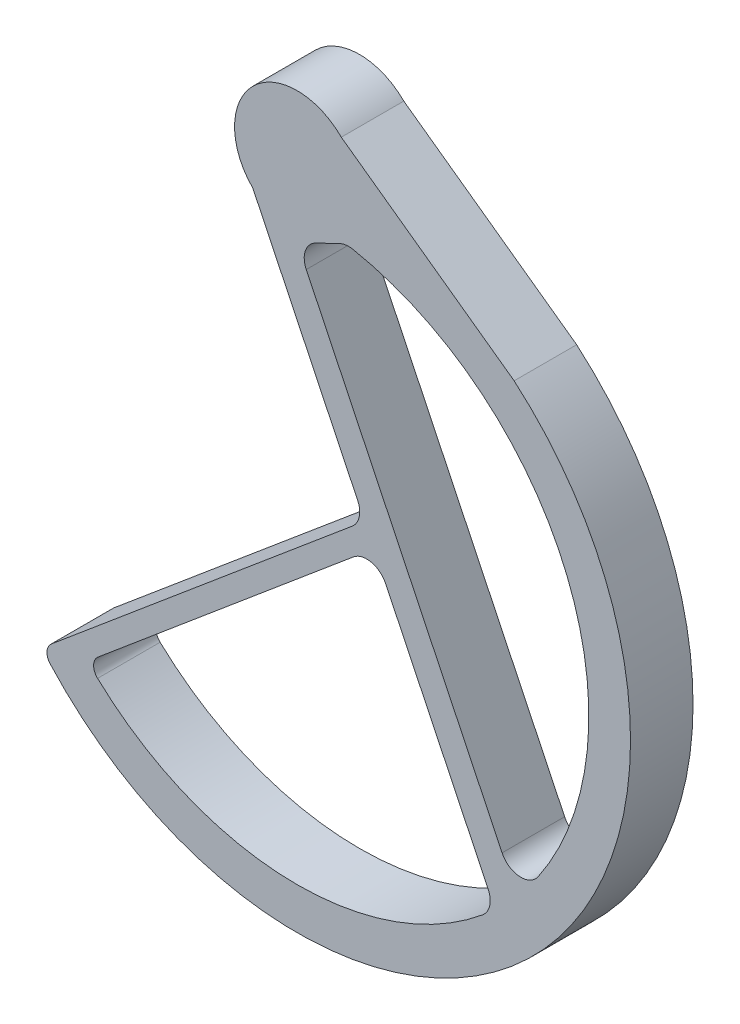
ISO-10303-21;
HEADER;
FILE_DESCRIPTION(('STEP AP214'),'2;1');
FILE_NAME('part.step','',(''),(''),'','','');
FILE_SCHEMA(('AUTOMOTIVE_DESIGN { 1 0 10303 214 1 1 1 1 }'));
ENDSEC;
DATA;
#1=APPLICATION_CONTEXT('core data for automotive mechanical design processes');
#2=APPLICATION_PROTOCOL_DEFINITION('international standard','automotive_design',2000,#1);
#3=PRODUCT_CONTEXT('',#1,'mechanical');
#4=PRODUCT('Part','Part','',(#3));
#5=PRODUCT_RELATED_PRODUCT_CATEGORY('part','',(#4));
#6=PRODUCT_DEFINITION_FORMATION('','',#4);
#7=PRODUCT_DEFINITION_CONTEXT('part definition',#1,'design');
#8=PRODUCT_DEFINITION('design','',#6,#7);
#9=PRODUCT_DEFINITION_SHAPE('','',#8);
#10=(LENGTH_UNIT() NAMED_UNIT(*) SI_UNIT(.MILLI.,.METRE.));
#11=(NAMED_UNIT(*) PLANE_ANGLE_UNIT() SI_UNIT($,.RADIAN.));
#12=(NAMED_UNIT(*) SI_UNIT($,.STERADIAN.) SOLID_ANGLE_UNIT());
#13=UNCERTAINTY_MEASURE_WITH_UNIT(LENGTH_MEASURE(1.E-05),#10,'distance_accuracy_value','');
#14=(GEOMETRIC_REPRESENTATION_CONTEXT(3) GLOBAL_UNCERTAINTY_ASSIGNED_CONTEXT((#13)) GLOBAL_UNIT_ASSIGNED_CONTEXT((#10,
#11,#12)) REPRESENTATION_CONTEXT('',''));
#15=CARTESIAN_POINT('',(0.,0.,0.));
#16=DIRECTION('',(0.,0.,1.));
#17=DIRECTION('',(1.,0.,0.));
#18=AXIS2_PLACEMENT_3D('',#15,#16,#17);
#19=CARTESIAN_POINT('',(-12.7570586950624,-6.1348621133076,15.));
#20=DIRECTION('',(0.901206602628173,0.433389731511241,0.));
#21=DIRECTION('',(-0.433389731511241,0.901206602628173,0.));
#22=AXIS2_PLACEMENT_3D('',#19,#20,#21);
#23=PLANE('',#22);
#24=DIRECTION('',(0.433389731511241,-0.901206602628173,0.));
#25=VECTOR('',#24,1.);
#26=CARTESIAN_POINT('',(-12.7570586950624,-6.1348621133076,0.));
#27=LINE('',#26,#25);
#28=CARTESIAN_POINT('',(21.2324006956412,-76.8137984043253,0.));
#29=VERTEX_POINT('',#28);
#30=CARTESIAN_POINT('',(45.844843506453,-127.9938203457,0.));
#31=VERTEX_POINT('',#30);
#32=EDGE_CURVE('E278',#29,#31,#27,.T.);
#33=ORIENTED_EDGE('',*,*,#32,.T.);
#34=DIRECTION('',(0.,0.,-1.));
#35=VECTOR('',#34,1.);
#36=CARTESIAN_POINT('',(45.844843506453,-127.9938203457,15.));
#37=LINE('',#36,#35);
#38=CARTESIAN_POINT('',(45.844843506453,-127.9938203457,15.));
#39=VERTEX_POINT('',#38);
#40=EDGE_CURVE('E11',#39,#31,#37,.T.);
#41=ORIENTED_EDGE('',*,*,#40,.F.);
#42=DIRECTION('',(0.433389731511241,-0.901206602628173,0.));
#43=VECTOR('',#42,1.);
#44=CARTESIAN_POINT('',(-12.7570586950624,-6.1348621133076,15.));
#45=LINE('',#44,#43);
#46=CARTESIAN_POINT('',(21.2324006956412,-76.8137984043253,15.));
#47=VERTEX_POINT('',#46);
#48=EDGE_CURVE('E244',#47,#39,#45,.T.);
#49=ORIENTED_EDGE('',*,*,#48,.F.);
#50=DIRECTION('',(0.,0.,-1.));
#51=VECTOR('',#50,1.);
#52=CARTESIAN_POINT('',(21.2324006956412,-76.8137984043253,15.));
#53=LINE('',#52,#51);
#54=EDGE_CURVE('E292',#47,#29,#53,.T.);
#55=ORIENTED_EDGE('',*,*,#54,.T.);
#56=EDGE_LOOP('',(#33,#41,#49,#55));
#57=FACE_BOUND('',#56,.T.);
#58=ADVANCED_FACE('F35',(#57),#23,.F.);
#59=CARTESIAN_POINT('',(41.3388104933121,-130.160769003256,15.));
#60=DIRECTION('',(0.,0.,-1.));
#61=DIRECTION('',(-1.,0.,0.));
#62=AXIS2_PLACEMENT_3D('',#59,#60,#61);
#63=CYLINDRICAL_SURFACE('',#62,4.99999999999999);
#64=CARTESIAN_POINT('',(41.3388104933121,-130.160769003256,0.));
#65=DIRECTION('',(0.,0.,1.));
#66=DIRECTION('',(1.,0.,0.));
#67=AXIS2_PLACEMENT_3D('',#64,#65,#66);
#68=CIRCLE('',#67,4.99999999999999);
#69=CARTESIAN_POINT('',(44.5187189927976,-134.019289695814,0.));
#70=VERTEX_POINT('',#69);
#71=EDGE_CURVE('E281',#31,#70,#68,.F.);
#72=ORIENTED_EDGE('',*,*,#71,.T.);
#73=DIRECTION('',(0.,0.,-1.));
#74=VECTOR('',#73,1.);
#75=CARTESIAN_POINT('',(44.5187189927976,-134.019289695814,15.));
#76=LINE('',#75,#74);
#77=CARTESIAN_POINT('',(44.5187189927976,-134.019289695814,15.));
#78=VERTEX_POINT('',#77);
#79=EDGE_CURVE('E44',#78,#70,#76,.T.);
#80=ORIENTED_EDGE('',*,*,#79,.F.);
#81=CARTESIAN_POINT('',(41.3388104933121,-130.160769003256,15.));
#82=DIRECTION('',(0.,0.,1.));
#83=DIRECTION('',(1.,0.,0.));
#84=AXIS2_PLACEMENT_3D('',#81,#82,#83);
#85=CIRCLE('',#84,4.99999999999999);
#86=EDGE_CURVE('E247',#39,#78,#85,.F.);
#87=ORIENTED_EDGE('',*,*,#86,.F.);
#88=ORIENTED_EDGE('',*,*,#40,.T.);
#89=EDGE_LOOP('',(#72,#80,#87,#88));
#90=FACE_BOUND('',#89,.T.);
#91=ADVANCED_FACE('F358',(#90),#63,.F.);
#92=CARTESIAN_POINT('',(0.,-80.,15.));
#93=DIRECTION('',(0.,0.,-1.));
#94=DIRECTION('',(-1.,0.,0.));
#95=AXIS2_PLACEMENT_3D('',#92,#93,#94);
#96=CYLINDRICAL_SURFACE('',#95,70.);
#97=CARTESIAN_POINT('',(0.,-80.,0.));
#98=DIRECTION('',(0.,0.,1.));
#99=DIRECTION('',(1.,0.,0.));
#100=AXIS2_PLACEMENT_3D('',#97,#98,#99);
#101=CIRCLE('',#100,70.);
#102=CARTESIAN_POINT('',(-47.870174388264,-131.072951785042,0.));
#103=VERTEX_POINT('',#102);
#104=EDGE_CURVE('E284',#103,#70,#101,.T.);
#105=ORIENTED_EDGE('',*,*,#104,.F.);
#106=DIRECTION('',(0.,0.,-1.));
#107=VECTOR('',#106,1.);
#108=CARTESIAN_POINT('',(-47.870174388264,-131.072951785042,15.));
#109=LINE('',#108,#107);
#110=CARTESIAN_POINT('',(-47.870174388264,-131.072951785042,15.));
#111=VERTEX_POINT('',#110);
#112=EDGE_CURVE('E301',#111,#103,#109,.T.);
#113=ORIENTED_EDGE('',*,*,#112,.F.);
#114=CARTESIAN_POINT('',(0.,-80.,15.));
#115=DIRECTION('',(0.,0.,1.));
#116=DIRECTION('',(1.,0.,0.));
#117=AXIS2_PLACEMENT_3D('',#114,#115,#116);
#118=CIRCLE('',#117,70.);
#119=EDGE_CURVE('E249',#111,#78,#118,.T.);
#120=ORIENTED_EDGE('',*,*,#119,.T.);
#121=ORIENTED_EDGE('',*,*,#79,.T.);
#122=EDGE_LOOP('',(#105,#113,#120,#121));
#123=FACE_BOUND('',#122,.T.);
#124=ADVANCED_FACE('F364',(#123),#96,.F.);
#125=CARTESIAN_POINT('',(-45.8185954859101,-128.884110994254,15.));
#126=DIRECTION('',(0.,0.,-1.));
#127=DIRECTION('',(-1.,0.,0.));
#128=AXIS2_PLACEMENT_3D('',#125,#126,#127);
#129=CYLINDRICAL_SURFACE('',#128,2.99999999999979);
#130=CARTESIAN_POINT('',(-45.8185954859101,-128.884110994254,0.));
#131=DIRECTION('',(0.,0.,1.));
#132=DIRECTION('',(1.,0.,0.));
#133=AXIS2_PLACEMENT_3D('',#130,#131,#132);
#134=CIRCLE('',#133,2.99999999999979);
#135=CARTESIAN_POINT('',(-47.7476784165524,-126.586582094174,0.));
#136=VERTEX_POINT('',#135);
#137=EDGE_CURVE('E287',#103,#136,#134,.F.);
#138=ORIENTED_EDGE('',*,*,#137,.T.);
#139=DIRECTION('',(0.,0.,-1.));
#140=VECTOR('',#139,1.);
#141=CARTESIAN_POINT('',(-47.7476784165524,-126.586582094174,15.));
#142=LINE('',#141,#140);
#143=CARTESIAN_POINT('',(-47.7476784165524,-126.586582094174,15.));
#144=VERTEX_POINT('',#143);
#145=EDGE_CURVE('E298',#144,#136,#142,.T.);
#146=ORIENTED_EDGE('',*,*,#145,.F.);
#147=CARTESIAN_POINT('',(-45.8185954859101,-128.884110994254,15.));
#148=DIRECTION('',(0.,0.,1.));
#149=DIRECTION('',(1.,0.,0.));
#150=AXIS2_PLACEMENT_3D('',#147,#148,#149);
#151=CIRCLE('',#150,2.99999999999979);
#152=EDGE_CURVE('E252',#111,#144,#151,.F.);
#153=ORIENTED_EDGE('',*,*,#152,.F.);
#154=ORIENTED_EDGE('',*,*,#112,.T.);
#155=EDGE_LOOP('',(#138,#146,#153,#154));
#156=FACE_BOUND('',#155,.T.);
#157=ADVANCED_FACE('F370',(#156),#129,.F.);
#158=CARTESIAN_POINT('',(42.5956727933285,-50.7312504333006,15.));
#159=DIRECTION('',(-0.643027643547508,0.765842966693394,0.));
#160=DIRECTION('',(-0.765842966693394,-0.643027643547508,0.));
#161=AXIS2_PLACEMENT_3D('',#158,#159,#160);
#162=PLANE('',#161);
#163=DIRECTION('',(0.765842966693394,0.643027643547508,0.));
#164=VECTOR('',#163,1.);
#165=CARTESIAN_POINT('',(42.5956727933285,-50.7312504333006,0.));
#166=LINE('',#165,#164);
#167=CARTESIAN_POINT('',(13.5112294647628,-75.1515322284145,0.));
#168=VERTEX_POINT('',#167);
#169=EDGE_CURVE('E289',#136,#168,#166,.T.);
#170=ORIENTED_EDGE('',*,*,#169,.T.);
#171=DIRECTION('',(0.,0.,-1.));
#172=VECTOR('',#171,1.);
#173=CARTESIAN_POINT('',(13.5112294647628,-75.1515322284145,15.));
#174=LINE('',#173,#172);
#175=CARTESIAN_POINT('',(13.5112294647628,-75.1515322284145,15.));
#176=VERTEX_POINT('',#175);
#177=EDGE_CURVE('E295',#176,#168,#174,.T.);
#178=ORIENTED_EDGE('',*,*,#177,.F.);
#179=DIRECTION('',(0.765842966693394,0.643027643547508,0.));
#180=VECTOR('',#179,1.);
#181=CARTESIAN_POINT('',(42.5956727933285,-50.7312504333006,15.));
#182=LINE('',#181,#180);
#183=EDGE_CURVE('E254',#144,#176,#182,.T.);
#184=ORIENTED_EDGE('',*,*,#183,.F.);
#185=ORIENTED_EDGE('',*,*,#145,.T.);
#186=EDGE_LOOP('',(#170,#178,#184,#185));
#187=FACE_BOUND('',#186,.T.);
#188=ADVANCED_FACE('F374',(#187),#162,.F.);
#189=CARTESIAN_POINT('',(10.0302471408598,-65.0565868768263,15.));
#190=DIRECTION('',(0.,0.,-1.));
#191=DIRECTION('',(-1.,0.,0.));
#192=AXIS2_PLACEMENT_3D('',#189,#190,#191);
#193=CYLINDRICAL_SURFACE('',#192,5.);
#194=CARTESIAN_POINT('',(10.0302471408598,-65.0565868768263,0.));
#195=DIRECTION('',(0.,0.,1.));
#196=DIRECTION('',(1.,0.,0.));
#197=AXIS2_PLACEMENT_3D('',#194,#195,#196);
#198=CIRCLE('',#197,5.);
#199=CARTESIAN_POINT('',(13.2441851892925,-68.8868090924212,0.));
#200=VERTEX_POINT('',#199);
#201=CARTESIAN_POINT('',(14.5362801540007,-62.8896382192701,0.));
#202=VERTEX_POINT('',#201);
#203=EDGE_CURVE('E217',#200,#202,#198,.T.);
#204=ORIENTED_EDGE('',*,*,#203,.F.);
#205=DIRECTION('',(0.,0.,-1.));
#206=VECTOR('',#205,1.);
#207=CARTESIAN_POINT('',(13.2441851892925,-68.8868090924212,15.));
#208=LINE('',#207,#206);
#209=CARTESIAN_POINT('',(13.2441851892925,-68.8868090924212,15.));
#210=VERTEX_POINT('',#209);
#211=EDGE_CURVE('E39',#210,#200,#208,.T.);
#212=ORIENTED_EDGE('',*,*,#211,.F.);
#213=CARTESIAN_POINT('',(10.0302471408598,-65.0565868768263,15.));
#214=DIRECTION('',(0.,0.,1.));
#215=DIRECTION('',(1.,0.,0.));
#216=AXIS2_PLACEMENT_3D('',#213,#214,#215);
#217=CIRCLE('',#216,5.);
#218=CARTESIAN_POINT('',(14.5362801540007,-62.8896382192701,15.));
#219=VERTEX_POINT('',#218);
#220=EDGE_CURVE('E225',#210,#219,#217,.T.);
#221=ORIENTED_EDGE('',*,*,#220,.T.);
#222=DIRECTION('',(0.,0.,-1.));
#223=VECTOR('',#222,1.);
#224=CARTESIAN_POINT('',(14.5362801540007,-62.8896382192701,15.));
#225=LINE('',#224,#223);
#226=EDGE_CURVE('E258',#219,#202,#225,.T.);
#227=ORIENTED_EDGE('',*,*,#226,.T.);
#228=EDGE_LOOP('',(#204,#212,#221,#227));
#229=FACE_BOUND('',#228,.T.);
#230=ADVANCED_FACE('F37',(#229),#193,.F.);
#231=CARTESIAN_POINT('',(39.3923101204882,-46.9459271066778,15.));
#232=DIRECTION('',(-0.642787609686534,0.766044443118983,0.));
#233=DIRECTION('',(-0.766044443118982,-0.642787609686534,0.));
#234=AXIS2_PLACEMENT_3D('',#231,#232,#233);
#235=PLANE('',#234);
#236=DIRECTION('',(0.766044443118982,0.642787609686534,0.));
#237=VECTOR('',#236,1.);
#238=CARTESIAN_POINT('',(39.3923101204882,-46.9459271066778,0.));
#239=LINE('',#238,#237);
#240=CARTESIAN_POINT('',(-58.9406362868111,-129.457066169617,0.));
#241=VERTEX_POINT('',#240);
#242=EDGE_CURVE('E261',#241,#200,#239,.T.);
#243=ORIENTED_EDGE('',*,*,#242,.F.);
#244=DIRECTION('',(0.,0.,-1.));
#245=VECTOR('',#244,1.);
#246=CARTESIAN_POINT('',(-58.9406362868111,-129.457066169617,15.));
#247=LINE('',#246,#245);
#248=CARTESIAN_POINT('',(-58.9406362868111,-129.457066169617,15.));
#249=VERTEX_POINT('',#248);
#250=EDGE_CURVE('E313',#249,#241,#247,.T.);
#251=ORIENTED_EDGE('',*,*,#250,.F.);
#252=DIRECTION('',(0.766044443118982,0.642787609686534,0.));
#253=VECTOR('',#252,1.);
#254=CARTESIAN_POINT('',(39.3923101204882,-46.9459271066778,15.));
#255=LINE('',#254,#253);
#256=EDGE_CURVE('E228',#249,#210,#255,.T.);
#257=ORIENTED_EDGE('',*,*,#256,.T.);
#258=ORIENTED_EDGE('',*,*,#211,.T.);
#259=EDGE_LOOP('',(#243,#251,#257,#258));
#260=FACE_BOUND('',#259,.T.);
#261=ADVANCED_FACE('F319',(#260),#235,.T.);
#262=CARTESIAN_POINT('',(-57.0122734577518,-131.755199498973,15.));
#263=DIRECTION('',(0.,0.,-1.));
#264=DIRECTION('',(-1.,0.,0.));
#265=AXIS2_PLACEMENT_3D('',#262,#263,#264);
#266=CYLINDRICAL_SURFACE('',#265,2.99999999999976);
#267=CARTESIAN_POINT('',(-57.0122734577518,-131.755199498973,0.));
#268=DIRECTION('',(0.,0.,1.));
#269=DIRECTION('',(1.,0.,0.));
#270=AXIS2_PLACEMENT_3D('',#267,#268,#269);
#271=CIRCLE('',#270,2.99999999999976);
#272=CARTESIAN_POINT('',(-59.2335308651964,-133.771635843089,0.));
#273=VERTEX_POINT('',#272);
#274=EDGE_CURVE('E264',#273,#241,#271,.F.);
#275=ORIENTED_EDGE('',*,*,#274,.F.);
#276=DIRECTION('',(0.,0.,-1.));
#277=VECTOR('',#276,1.);
#278=CARTESIAN_POINT('',(-59.2335308651964,-133.771635843089,15.));
#279=LINE('',#278,#277);
#280=CARTESIAN_POINT('',(-59.2335308651964,-133.771635843089,15.));
#281=VERTEX_POINT('',#280);
#282=EDGE_CURVE('E312',#281,#273,#279,.T.);
#283=ORIENTED_EDGE('',*,*,#282,.F.);
#284=CARTESIAN_POINT('',(-57.0122734577518,-131.755199498973,15.));
#285=DIRECTION('',(0.,0.,1.));
#286=DIRECTION('',(1.,0.,0.));
#287=AXIS2_PLACEMENT_3D('',#284,#285,#286);
#288=CIRCLE('',#287,2.99999999999976);
#289=EDGE_CURVE('E232',#281,#249,#288,.F.);
#290=ORIENTED_EDGE('',*,*,#289,.T.);
#291=ORIENTED_EDGE('',*,*,#250,.T.);
#292=EDGE_LOOP('',(#275,#283,#290,#291));
#293=FACE_BOUND('',#292,.T.);
#294=ADVANCED_FACE('F327',(#293),#266,.T.);
#295=CARTESIAN_POINT('',(0.,-80.,15.));
#296=DIRECTION('',(0.,0.,-1.));
#297=DIRECTION('',(-1.,0.,0.));
#298=AXIS2_PLACEMENT_3D('',#295,#296,#297);
#299=CYLINDRICAL_SURFACE('',#298,80.);
#300=CARTESIAN_POINT('',(0.,-80.,0.));
#301=DIRECTION('',(0.,0.,1.));
#302=DIRECTION('',(1.,0.,0.));
#303=AXIS2_PLACEMENT_3D('',#300,#301,#302);
#304=CIRCLE('',#303,80.);
#305=CARTESIAN_POINT('',(52.0761789176773,-19.2705047828153,0.));
#306=VERTEX_POINT('',#305);
#307=EDGE_CURVE('E267',#273,#306,#304,.T.);
#308=ORIENTED_EDGE('',*,*,#307,.T.);
#309=DIRECTION('',(0.,0.,-1.));
#310=VECTOR('',#309,1.);
#311=CARTESIAN_POINT('',(52.0761789176773,-19.2705047828153,15.));
#312=LINE('',#311,#310);
#313=CARTESIAN_POINT('',(52.0761789176773,-19.2705047828153,15.));
#314=VERTEX_POINT('',#313);
#315=EDGE_CURVE('E310',#314,#306,#312,.T.);
#316=ORIENTED_EDGE('',*,*,#315,.F.);
#317=CARTESIAN_POINT('',(0.,-80.,15.));
#318=DIRECTION('',(0.,0.,1.));
#319=DIRECTION('',(1.,0.,0.));
#320=AXIS2_PLACEMENT_3D('',#317,#318,#319);
#321=CIRCLE('',#320,80.);
#322=EDGE_CURVE('E235',#281,#314,#321,.T.);
#323=ORIENTED_EDGE('',*,*,#322,.F.);
#324=ORIENTED_EDGE('',*,*,#282,.T.);
#325=EDGE_LOOP('',(#308,#316,#323,#324));
#326=FACE_BOUND('',#325,.T.);
#327=ADVANCED_FACE('F332',(#326),#299,.T.);
#328=CARTESIAN_POINT('',(8.65474635415258,12.0128323695446,15.));
#329=DIRECTION('',(0.584549661802916,0.811357931424902,0.));
#330=DIRECTION('',(-0.811357931424902,0.584549661802916,0.));
#331=AXIS2_PLACEMENT_3D('',#328,#329,#330);
#332=PLANE('',#331);
#333=DIRECTION('',(0.811357931424902,-0.584549661802916,0.));
#334=VECTOR('',#333,1.);
#335=CARTESIAN_POINT('',(8.65474635415258,12.0128323695446,0.));
#336=LINE('',#335,#334);
#337=CARTESIAN_POINT('',(10.6066017177981,10.6066017177983,0.));
#338=VERTEX_POINT('',#337);
#339=EDGE_CURVE('E270',#338,#306,#336,.T.);
#340=ORIENTED_EDGE('',*,*,#339,.F.);
#341=DIRECTION('',(0.,0.,-1.));
#342=VECTOR('',#341,1.);
#343=CARTESIAN_POINT('',(10.6066017177981,10.6066017177983,15.));
#344=LINE('',#343,#342);
#345=CARTESIAN_POINT('',(10.6066017177981,10.6066017177983,15.));
#346=VERTEX_POINT('',#345);
#347=EDGE_CURVE('E308',#346,#338,#344,.T.);
#348=ORIENTED_EDGE('',*,*,#347,.F.);
#349=DIRECTION('',(0.811357931424902,-0.584549661802916,0.));
#350=VECTOR('',#349,1.);
#351=CARTESIAN_POINT('',(8.65474635415258,12.0128323695446,15.));
#352=LINE('',#351,#350);
#353=EDGE_CURVE('E237',#346,#314,#352,.T.);
#354=ORIENTED_EDGE('',*,*,#353,.T.);
#355=ORIENTED_EDGE('',*,*,#315,.T.);
#356=EDGE_LOOP('',(#340,#348,#354,#355));
#357=FACE_BOUND('',#356,.T.);
#358=ADVANCED_FACE('F346',(#357),#332,.T.);
#359=CARTESIAN_POINT('',(0.,0.,15.));
#360=DIRECTION('',(0.,0.,-1.));
#361=DIRECTION('',(-1.,0.,0.));
#362=AXIS2_PLACEMENT_3D('',#359,#360,#361);
#363=CYLINDRICAL_SURFACE('',#362,15.);
#364=CARTESIAN_POINT('',(0.,0.,0.));
#365=DIRECTION('',(0.,0.,1.));
#366=DIRECTION('',(1.,0.,0.));
#367=AXIS2_PLACEMENT_3D('',#364,#365,#366);
#368=CIRCLE('',#367,15.);
#369=CARTESIAN_POINT('',(-10.6066017177981,-10.6066017177983,0.));
#370=VERTEX_POINT('',#369);
#371=EDGE_CURVE('E273',#338,#370,#368,.T.);
#372=ORIENTED_EDGE('',*,*,#371,.T.);
#373=DIRECTION('',(0.,0.,-1.));
#374=VECTOR('',#373,1.);
#375=CARTESIAN_POINT('',(-10.6066017177981,-10.6066017177983,15.));
#376=LINE('',#375,#374);
#377=CARTESIAN_POINT('',(-10.6066017177981,-10.6066017177983,15.));
#378=VERTEX_POINT('',#377);
#379=EDGE_CURVE('E305',#378,#370,#376,.T.);
#380=ORIENTED_EDGE('',*,*,#379,.F.);
#381=CARTESIAN_POINT('',(0.,0.,15.));
#382=DIRECTION('',(0.,0.,1.));
#383=DIRECTION('',(1.,0.,0.));
#384=AXIS2_PLACEMENT_3D('',#381,#382,#383);
#385=CIRCLE('',#384,15.);
#386=EDGE_CURVE('E240',#346,#378,#385,.T.);
#387=ORIENTED_EDGE('',*,*,#386,.F.);
#388=ORIENTED_EDGE('',*,*,#347,.T.);
#389=EDGE_LOOP('',(#372,#380,#387,#388));
#390=FACE_BOUND('',#389,.T.);
#391=ADVANCED_FACE('F347',(#390),#363,.T.);
#392=CARTESIAN_POINT('',(-12.7570586950624,-6.13486211330761,15.));
#393=DIRECTION('',(0.901206602628173,0.433389731511242,0.));
#394=DIRECTION('',(-0.433389731511242,0.901206602628173,0.));
#395=AXIS2_PLACEMENT_3D('',#392,#393,#394);
#396=PLANE('',#395);
#397=DIRECTION('',(0.433389731511242,-0.901206602628173,0.));
#398=VECTOR('',#397,1.);
#399=CARTESIAN_POINT('',(-12.7570586950624,-6.13486211330761,0.));
#400=LINE('',#399,#398);
#401=EDGE_CURVE('E275',#370,#202,#400,.T.);
#402=ORIENTED_EDGE('',*,*,#401,.T.);
#403=ORIENTED_EDGE('',*,*,#226,.F.);
#404=DIRECTION('',(0.433389731511242,-0.901206602628173,0.));
#405=VECTOR('',#404,1.);
#406=CARTESIAN_POINT('',(-12.7570586950624,-6.13486211330761,15.));
#407=LINE('',#406,#405);
#408=EDGE_CURVE('E242',#378,#219,#407,.T.);
#409=ORIENTED_EDGE('',*,*,#408,.F.);
#410=ORIENTED_EDGE('',*,*,#379,.T.);
#411=EDGE_LOOP('',(#402,#403,#409,#410));
#412=FACE_BOUND('',#411,.T.);
#413=ADVANCED_FACE('F341',(#412),#396,.F.);
#414=CARTESIAN_POINT('',(16.7263676825004,-78.9807470618814,15.));
#415=DIRECTION('',(0.,0.,-1.));
#416=DIRECTION('',(-1.,0.,0.));
#417=AXIS2_PLACEMENT_3D('',#414,#415,#416);
#418=CYLINDRICAL_SURFACE('',#417,5.);
#419=CARTESIAN_POINT('',(16.7263676825004,-78.9807470618814,0.));
#420=DIRECTION('',(0.,0.,1.));
#421=DIRECTION('',(1.,0.,0.));
#422=AXIS2_PLACEMENT_3D('',#419,#420,#421);
#423=CIRCLE('',#422,5.);
#424=EDGE_CURVE('E229',#168,#29,#423,.F.);
#425=ORIENTED_EDGE('',*,*,#424,.T.);
#426=ORIENTED_EDGE('',*,*,#54,.F.);
#427=CARTESIAN_POINT('',(16.7263676825004,-78.9807470618814,15.));
#428=DIRECTION('',(0.,0.,1.));
#429=DIRECTION('',(1.,0.,0.));
#430=AXIS2_PLACEMENT_3D('',#427,#428,#429);
#431=CIRCLE('',#430,5.);
#432=EDGE_CURVE('E256',#176,#47,#431,.F.);
#433=ORIENTED_EDGE('',*,*,#432,.F.);
#434=ORIENTED_EDGE('',*,*,#177,.T.);
#435=EDGE_LOOP('',(#425,#426,#433,#434));
#436=FACE_BOUND('',#435,.T.);
#437=ADVANCED_FACE('F354',(#436),#418,.F.);
#438=CARTESIAN_POINT('',(0.,0.,15.));
#439=DIRECTION('',(0.,0.,1.));
#440=DIRECTION('',(1.,0.,0.));
#441=AXIS2_PLACEMENT_3D('',#438,#439,#440);
#442=PLANE('',#441);
#443=CARTESIAN_POINT('',(6.70778479931193,-18.9220720384942,15.));
#444=DIRECTION('',(0.,0.,1.));
#445=DIRECTION('',(-1.,0.,0.));
#446=AXIS2_PLACEMENT_3D('',#443,#444,#445);
#447=CIRCLE('',#446,5.);
#448=CARTESIAN_POINT('',(4.54083614175573,-14.4160390253533,15.));
#449=VERTEX_POINT('',#448);
#450=CARTESIAN_POINT('',(2.20175178617109,-21.0890206960504,15.));
#451=VERTEX_POINT('',#450);
#452=EDGE_CURVE('E52',#449,#451,#447,.T.);
#453=ORIENTED_EDGE('',*,*,#452,.F.);
#454=DIRECTION('',(-0.901206602628171,-0.433389731511247,0.));
#455=VECTOR('',#454,1.);
#456=CARTESIAN_POINT('',(6.4834156052804,-13.4818536901804,15.));
#457=LINE('',#456,#455);
#458=CARTESIAN_POINT('',(10.2196588467731,-11.6850964864837,15.));
#459=VERTEX_POINT('',#458);
#460=EDGE_CURVE('E187',#459,#449,#457,.T.);
#461=ORIENTED_EDGE('',*,*,#460,.F.);
#462=CARTESIAN_POINT('',(12.3866075043293,-16.1911294996245,15.));
#463=DIRECTION('',(0.,0.,1.));
#464=DIRECTION('',(1.,0.,0.));
#465=AXIS2_PLACEMENT_3D('',#462,#463,#464);
#466=CIRCLE('',#465,5.);
#467=CARTESIAN_POINT('',(13.3394234662008,-11.2827548457495,15.));
#468=VERTEX_POINT('',#467);
#469=EDGE_CURVE('E190',#468,#459,#466,.T.);
#470=ORIENTED_EDGE('',*,*,#469,.F.);
#471=CARTESIAN_POINT('',(0.,-80.,15.));
#472=DIRECTION('',(0.,0.,1.));
#473=DIRECTION('',(1.,0.,0.));
#474=AXIS2_PLACEMENT_3D('',#471,#472,#473);
#475=CIRCLE('',#474,69.9999999999999);
#476=CARTESIAN_POINT('',(57.8260553336624,-119.448033215209,15.));
#477=VERTEX_POINT('',#476);
#478=EDGE_CURVE('E210',#477,#468,#475,.T.);
#479=ORIENTED_EDGE('',*,*,#478,.F.);
#480=CARTESIAN_POINT('',(53.6956228098294,-116.63031655698,15.));
#481=DIRECTION('',(0.,0.,1.));
#482=DIRECTION('',(-1.,0.,0.));
#483=AXIS2_PLACEMENT_3D('',#480,#481,#482);
#484=CIRCLE('',#483,5.);
#485=CARTESIAN_POINT('',(49.1895897966885,-118.797265214536,15.));
#486=VERTEX_POINT('',#485);
#487=EDGE_CURVE('E207',#486,#477,#484,.T.);
#488=ORIENTED_EDGE('',*,*,#487,.F.);
#489=DIRECTION('',(0.433389731511244,-0.901206602628172,0.));
#490=VECTOR('',#489,1.);
#491=CARTESIAN_POINT('',(49.1895897966885,-118.797265214536,15.));
#492=LINE('',#491,#490);
#493=EDGE_CURVE('E204',#451,#486,#492,.T.);
#494=ORIENTED_EDGE('',*,*,#493,.F.);
#495=EDGE_LOOP('',(#453,#461,#470,#479,#488,#494));
#496=FACE_BOUND('',#495,.T.);
#497=ORIENTED_EDGE('',*,*,#220,.F.);
#498=ORIENTED_EDGE('',*,*,#256,.F.);
#499=ORIENTED_EDGE('',*,*,#289,.F.);
#500=ORIENTED_EDGE('',*,*,#322,.T.);
#501=ORIENTED_EDGE('',*,*,#353,.F.);
#502=ORIENTED_EDGE('',*,*,#386,.T.);
#503=ORIENTED_EDGE('',*,*,#408,.T.);
#504=EDGE_LOOP('',(#497,#498,#499,#500,#501,#502,#503));
#505=FACE_BOUND('',#504,.T.);
#506=ORIENTED_EDGE('',*,*,#48,.T.);
#507=ORIENTED_EDGE('',*,*,#86,.T.);
#508=ORIENTED_EDGE('',*,*,#119,.F.);
#509=ORIENTED_EDGE('',*,*,#152,.T.);
#510=ORIENTED_EDGE('',*,*,#183,.T.);
#511=ORIENTED_EDGE('',*,*,#432,.T.);
#512=EDGE_LOOP('',(#506,#507,#508,#509,#510,#511));
#513=FACE_BOUND('',#512,.T.);
#514=ADVANCED_FACE('F335',(#496,#505,#513),#442,.T.);
#515=CARTESIAN_POINT('',(0.,0.,0.));
#516=DIRECTION('',(0.,0.,1.));
#517=DIRECTION('',(1.,0.,0.));
#518=AXIS2_PLACEMENT_3D('',#515,#516,#517);
#519=PLANE('',#518);
#520=CARTESIAN_POINT('',(0.,0.,0.));
#521=DIRECTION('',(0.,0.,-1.));
#522=DIRECTION('',(-1.,0.,0.));
#523=AXIS2_PLACEMENT_3D('',#520,#521,#522);
#524=CIRCLE('',#523,10.);
#525=CARTESIAN_POINT('',(-10.,0.,0.));
#526=VERTEX_POINT('',#525);
#527=EDGE_CURVE('E193',#526,#526,#524,.T.);
#528=ORIENTED_EDGE('',*,*,#527,.F.);
#529=EDGE_LOOP('',(#528));
#530=FACE_BOUND('',#529,.T.);
#531=DIRECTION('',(-0.90120660262817,-0.433389731511248,0.));
#532=VECTOR('',#531,1.);
#533=CARTESIAN_POINT('',(6.4834156052804,-13.4818536901804,0.));
#534=LINE('',#533,#532);
#535=CARTESIAN_POINT('',(10.2196588467731,-11.6850964864837,0.));
#536=VERTEX_POINT('',#535);
#537=CARTESIAN_POINT('',(4.54083614175573,-14.4160390253533,0.));
#538=VERTEX_POINT('',#537);
#539=EDGE_CURVE('E176',#536,#538,#534,.T.);
#540=ORIENTED_EDGE('',*,*,#539,.T.);
#541=CARTESIAN_POINT('',(6.70778479931193,-18.9220720384942,0.));
#542=DIRECTION('',(0.,0.,1.));
#543=DIRECTION('',(-1.,0.,0.));
#544=AXIS2_PLACEMENT_3D('',#541,#542,#543);
#545=CIRCLE('',#544,5.);
#546=CARTESIAN_POINT('',(2.20175178617109,-21.0890206960504,0.));
#547=VERTEX_POINT('',#546);
#548=EDGE_CURVE('E170',#538,#547,#545,.T.);
#549=ORIENTED_EDGE('',*,*,#548,.T.);
#550=DIRECTION('',(0.433389731511244,-0.901206602628172,0.));
#551=VECTOR('',#550,1.);
#552=CARTESIAN_POINT('',(49.1895897966885,-118.797265214536,0.));
#553=LINE('',#552,#551);
#554=CARTESIAN_POINT('',(49.1895897966885,-118.797265214536,0.));
#555=VERTEX_POINT('',#554);
#556=EDGE_CURVE('E179',#547,#555,#553,.T.);
#557=ORIENTED_EDGE('',*,*,#556,.T.);
#558=CARTESIAN_POINT('',(53.6956228098294,-116.63031655698,0.));
#559=DIRECTION('',(0.,0.,1.));
#560=DIRECTION('',(-1.,0.,0.));
#561=AXIS2_PLACEMENT_3D('',#558,#559,#560);
#562=CIRCLE('',#561,5.);
#563=CARTESIAN_POINT('',(57.8260553336624,-119.448033215209,0.));
#564=VERTEX_POINT('',#563);
#565=EDGE_CURVE('E60',#555,#564,#562,.T.);
#566=ORIENTED_EDGE('',*,*,#565,.T.);
#567=CARTESIAN_POINT('',(0.,-80.,0.));
#568=DIRECTION('',(0.,0.,1.));
#569=DIRECTION('',(1.,0.,0.));
#570=AXIS2_PLACEMENT_3D('',#567,#568,#569);
#571=CIRCLE('',#570,69.9999999999999);
#572=CARTESIAN_POINT('',(13.3394234662008,-11.2827548457495,0.));
#573=VERTEX_POINT('',#572);
#574=EDGE_CURVE('E197',#564,#573,#571,.T.);
#575=ORIENTED_EDGE('',*,*,#574,.T.);
#576=CARTESIAN_POINT('',(12.3866075043293,-16.1911294996245,0.));
#577=DIRECTION('',(0.,0.,1.));
#578=DIRECTION('',(1.,0.,0.));
#579=AXIS2_PLACEMENT_3D('',#576,#577,#578);
#580=CIRCLE('',#579,5.);
#581=EDGE_CURVE('E200',#573,#536,#580,.T.);
#582=ORIENTED_EDGE('',*,*,#581,.T.);
#583=EDGE_LOOP('',(#540,#549,#557,#566,#575,#582));
#584=FACE_BOUND('',#583,.T.);
#585=ORIENTED_EDGE('',*,*,#203,.T.);
#586=ORIENTED_EDGE('',*,*,#401,.F.);
#587=ORIENTED_EDGE('',*,*,#371,.F.);
#588=ORIENTED_EDGE('',*,*,#339,.T.);
#589=ORIENTED_EDGE('',*,*,#307,.F.);
#590=ORIENTED_EDGE('',*,*,#274,.T.);
#591=ORIENTED_EDGE('',*,*,#242,.T.);
#592=EDGE_LOOP('',(#585,#586,#587,#588,#589,#590,#591));
#593=FACE_BOUND('',#592,.T.);
#594=ORIENTED_EDGE('',*,*,#32,.F.);
#595=ORIENTED_EDGE('',*,*,#424,.F.);
#596=ORIENTED_EDGE('',*,*,#169,.F.);
#597=ORIENTED_EDGE('',*,*,#137,.F.);
#598=ORIENTED_EDGE('',*,*,#104,.T.);
#599=ORIENTED_EDGE('',*,*,#71,.F.);
#600=EDGE_LOOP('',(#594,#595,#596,#597,#598,#599));
#601=FACE_BOUND('',#600,.T.);
#602=ADVANCED_FACE('F183',(#530,#584,#593,#601),#519,.F.);
#603=CARTESIAN_POINT('',(6.70778479931193,-18.9220720384942,0.));
#604=DIRECTION('',(0.,0.,1.));
#605=DIRECTION('',(1.,0.,0.));
#606=AXIS2_PLACEMENT_3D('',#603,#604,#605);
#607=CYLINDRICAL_SURFACE('',#606,5.);
#608=ORIENTED_EDGE('',*,*,#452,.T.);
#609=DIRECTION('',(0.,0.,1.));
#610=VECTOR('',#609,1.);
#611=CARTESIAN_POINT('',(2.20175178617109,-21.0890206960504,0.));
#612=LINE('',#611,#610);
#613=EDGE_CURVE('E166',#547,#451,#612,.T.);
#614=ORIENTED_EDGE('',*,*,#613,.F.);
#615=ORIENTED_EDGE('',*,*,#548,.F.);
#616=DIRECTION('',(0.,0.,1.));
#617=VECTOR('',#616,1.);
#618=CARTESIAN_POINT('',(4.54083614175573,-14.4160390253533,0.));
#619=LINE('',#618,#617);
#620=EDGE_CURVE('E215',#538,#449,#619,.T.);
#621=ORIENTED_EDGE('',*,*,#620,.T.);
#622=EDGE_LOOP('',(#608,#614,#615,#621));
#623=FACE_BOUND('',#622,.T.);
#624=ADVANCED_FACE('F168',(#623),#607,.F.);
#625=CARTESIAN_POINT('',(6.4834156052804,-13.4818536901804,0.));
#626=DIRECTION('',(-0.433389731511247,0.901206602628171,0.));
#627=DIRECTION('',(-0.901206602628171,-0.433389731511247,0.));
#628=AXIS2_PLACEMENT_3D('',#625,#626,#627);
#629=PLANE('',#628);
#630=ORIENTED_EDGE('',*,*,#460,.T.);
#631=ORIENTED_EDGE('',*,*,#620,.F.);
#632=ORIENTED_EDGE('',*,*,#539,.F.);
#633=DIRECTION('',(0.,0.,1.));
#634=VECTOR('',#633,1.);
#635=CARTESIAN_POINT('',(10.2196588467731,-11.6850964864837,0.));
#636=LINE('',#635,#634);
#637=EDGE_CURVE('E218',#536,#459,#636,.T.);
#638=ORIENTED_EDGE('',*,*,#637,.T.);
#639=EDGE_LOOP('',(#630,#631,#632,#638));
#640=FACE_BOUND('',#639,.T.);
#641=ADVANCED_FACE('F390',(#640),#629,.F.);
#642=CARTESIAN_POINT('',(12.3866075043293,-16.1911294996245,0.));
#643=DIRECTION('',(0.,0.,1.));
#644=DIRECTION('',(1.,0.,0.));
#645=AXIS2_PLACEMENT_3D('',#642,#643,#644);
#646=CYLINDRICAL_SURFACE('',#645,5.);
#647=ORIENTED_EDGE('',*,*,#469,.T.);
#648=ORIENTED_EDGE('',*,*,#637,.F.);
#649=ORIENTED_EDGE('',*,*,#581,.F.);
#650=DIRECTION('',(0.,0.,1.));
#651=VECTOR('',#650,1.);
#652=CARTESIAN_POINT('',(13.3394234662008,-11.2827548457495,0.));
#653=LINE('',#652,#651);
#654=EDGE_CURVE('E220',#573,#468,#653,.T.);
#655=ORIENTED_EDGE('',*,*,#654,.T.);
#656=EDGE_LOOP('',(#647,#648,#649,#655));
#657=FACE_BOUND('',#656,.T.);
#658=ADVANCED_FACE('F400',(#657),#646,.F.);
#659=CARTESIAN_POINT('',(0.,-80.,0.));
#660=DIRECTION('',(0.,0.,1.));
#661=DIRECTION('',(1.,0.,0.));
#662=AXIS2_PLACEMENT_3D('',#659,#660,#661);
#663=CYLINDRICAL_SURFACE('',#662,69.9999999999999);
#664=ORIENTED_EDGE('',*,*,#478,.T.);
#665=ORIENTED_EDGE('',*,*,#654,.F.);
#666=ORIENTED_EDGE('',*,*,#574,.F.);
#667=DIRECTION('',(0.,0.,1.));
#668=VECTOR('',#667,1.);
#669=CARTESIAN_POINT('',(57.8260553336624,-119.448033215209,0.));
#670=LINE('',#669,#668);
#671=EDGE_CURVE('E222',#564,#477,#670,.T.);
#672=ORIENTED_EDGE('',*,*,#671,.T.);
#673=EDGE_LOOP('',(#664,#665,#666,#672));
#674=FACE_BOUND('',#673,.T.);
#675=ADVANCED_FACE('F397',(#674),#663,.F.);
#676=CARTESIAN_POINT('',(53.6956228098294,-116.63031655698,0.));
#677=DIRECTION('',(0.,0.,1.));
#678=DIRECTION('',(1.,0.,0.));
#679=AXIS2_PLACEMENT_3D('',#676,#677,#678);
#680=CYLINDRICAL_SURFACE('',#679,5.);
#681=ORIENTED_EDGE('',*,*,#487,.T.);
#682=ORIENTED_EDGE('',*,*,#671,.F.);
#683=ORIENTED_EDGE('',*,*,#565,.F.);
#684=DIRECTION('',(0.,0.,1.));
#685=VECTOR('',#684,1.);
#686=CARTESIAN_POINT('',(49.1895897966885,-118.797265214536,0.));
#687=LINE('',#686,#685);
#688=EDGE_CURVE('E175',#555,#486,#687,.T.);
#689=ORIENTED_EDGE('',*,*,#688,.T.);
#690=EDGE_LOOP('',(#681,#682,#683,#689));
#691=FACE_BOUND('',#690,.T.);
#692=ADVANCED_FACE('F394',(#691),#680,.F.);
#693=CARTESIAN_POINT('',(49.1895897966885,-118.797265214536,0.));
#694=DIRECTION('',(-0.901206602628172,-0.433389731511244,0.));
#695=DIRECTION('',(0.433389731511244,-0.901206602628172,0.));
#696=AXIS2_PLACEMENT_3D('',#693,#694,#695);
#697=PLANE('',#696);
#698=ORIENTED_EDGE('',*,*,#493,.T.);
#699=ORIENTED_EDGE('',*,*,#688,.F.);
#700=ORIENTED_EDGE('',*,*,#556,.F.);
#701=ORIENTED_EDGE('',*,*,#613,.T.);
#702=EDGE_LOOP('',(#698,#699,#700,#701));
#703=FACE_BOUND('',#702,.T.);
#704=ADVANCED_FACE('F180',(#703),#697,.F.);
#705=CARTESIAN_POINT('',(0.,0.,2.));
#706=DIRECTION('',(0.,0.,-1.));
#707=DIRECTION('',(-1.,0.,0.));
#708=AXIS2_PLACEMENT_3D('',#705,#706,#707);
#709=CYLINDRICAL_SURFACE('',#708,10.);
#710=CARTESIAN_POINT('',(0.,0.,2.));
#711=DIRECTION('',(0.,0.,-1.));
#712=DIRECTION('',(-1.,0.,0.));
#713=AXIS2_PLACEMENT_3D('',#710,#711,#712);
#714=CIRCLE('',#713,10.);
#715=CARTESIAN_POINT('',(-10.,0.,2.));
#716=VERTEX_POINT('',#715);
#717=EDGE_CURVE('E205',#716,#716,#714,.T.);
#718=ORIENTED_EDGE('',*,*,#717,.F.);
#719=EDGE_LOOP('',(#718));
#720=FACE_BOUND('',#719,.T.);
#721=ORIENTED_EDGE('',*,*,#527,.T.);
#722=EDGE_LOOP('',(#721));
#723=FACE_BOUND('',#722,.T.);
#724=ADVANCED_FACE('F393',(#720,#723),#709,.F.);
#725=CARTESIAN_POINT('',(0.,0.,2.));
#726=DIRECTION('',(0.,0.,-1.));
#727=DIRECTION('',(-1.,0.,0.));
#728=AXIS2_PLACEMENT_3D('',#725,#726,#727);
#729=PLANE('',#728);
#730=ORIENTED_EDGE('',*,*,#717,.T.);
#731=EDGE_LOOP('',(#730));
#732=FACE_BOUND('',#731,.T.);
#733=ADVANCED_FACE('F410',(#732),#729,.T.);
#734=CLOSED_SHELL('',(#58,#91,#124,#157,#188,#230,#261,#294,#327,#358,#391,#413,#437,#514,#602,
#624,#641,#658,#675,#692,#704,#724,#733));
#735=MANIFOLD_SOLID_BREP('B2',#734);
#736=ADVANCED_BREP_SHAPE_REPRESENTATION('',(#18,#735),#14);
#737=SHAPE_DEFINITION_REPRESENTATION(#9,#736);
ENDSEC;
END-ISO-10303-21;
